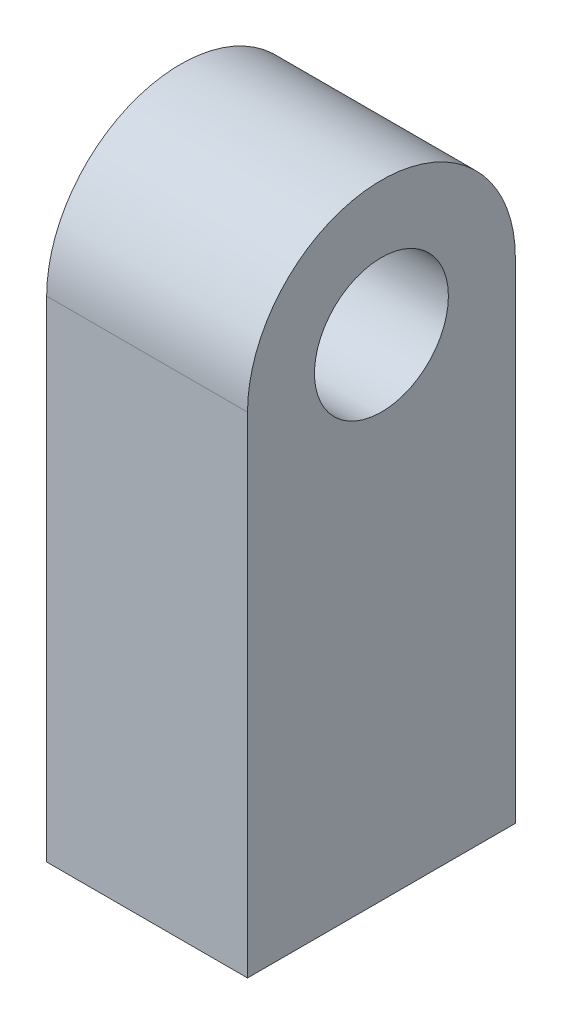
ISO-10303-21;
HEADER;
FILE_DESCRIPTION(('STEP AP214'),'2;1');
FILE_NAME('part.step','',(''),(''),'','','');
FILE_SCHEMA(('AUTOMOTIVE_DESIGN { 1 0 10303 214 1 1 1 1 }'));
ENDSEC;
DATA;
#1=APPLICATION_CONTEXT('core data for automotive mechanical design processes');
#2=APPLICATION_PROTOCOL_DEFINITION('international standard','automotive_design',2000,#1);
#3=PRODUCT_CONTEXT('',#1,'mechanical');
#4=PRODUCT('Part','Part','',(#3));
#5=PRODUCT_RELATED_PRODUCT_CATEGORY('part','',(#4));
#6=PRODUCT_DEFINITION_FORMATION('','',#4);
#7=PRODUCT_DEFINITION_CONTEXT('part definition',#1,'design');
#8=PRODUCT_DEFINITION('design','',#6,#7);
#9=PRODUCT_DEFINITION_SHAPE('','',#8);
#10=(LENGTH_UNIT() NAMED_UNIT(*) SI_UNIT(.MILLI.,.METRE.));
#11=(NAMED_UNIT(*) PLANE_ANGLE_UNIT() SI_UNIT($,.RADIAN.));
#12=(NAMED_UNIT(*) SI_UNIT($,.STERADIAN.) SOLID_ANGLE_UNIT());
#13=UNCERTAINTY_MEASURE_WITH_UNIT(LENGTH_MEASURE(1.E-05),#10,'distance_accuracy_value','');
#14=(GEOMETRIC_REPRESENTATION_CONTEXT(3) GLOBAL_UNCERTAINTY_ASSIGNED_CONTEXT((#13)) GLOBAL_UNIT_ASSIGNED_CONTEXT((#10,
#11,#12)) REPRESENTATION_CONTEXT('',''));
#15=CARTESIAN_POINT('',(0.,0.,0.));
#16=DIRECTION('',(0.,0.,1.));
#17=DIRECTION('',(1.,0.,0.));
#18=AXIS2_PLACEMENT_3D('',#15,#16,#17);
#19=CARTESIAN_POINT('',(4.5,28.,6.));
#20=DIRECTION('',(-1.,0.,0.));
#21=DIRECTION('',(0.,0.,1.));
#22=AXIS2_PLACEMENT_3D('',#19,#20,#21);
#23=PLANE('',#22);
#24=CARTESIAN_POINT('',(4.5,21.9586091682412,0.));
#25=DIRECTION('',(1.,0.,0.));
#26=DIRECTION('',(0.,0.,-1.));
#27=AXIS2_PLACEMENT_3D('',#24,#25,#26);
#28=CIRCLE('',#27,3.);
#29=CARTESIAN_POINT('',(4.5,21.9586091682412,-3.));
#30=VERTEX_POINT('',#29);
#31=EDGE_CURVE('E132',#30,#30,#28,.T.);
#32=ORIENTED_EDGE('',*,*,#31,.F.);
#33=EDGE_LOOP('',(#32));
#34=FACE_BOUND('',#33,.T.);
#35=CARTESIAN_POINT('',(4.5,21.9586091682412,0.));
#36=DIRECTION('',(1.,0.,0.));
#37=DIRECTION('',(0.,0.,-1.));
#38=AXIS2_PLACEMENT_3D('',#35,#36,#37);
#39=CIRCLE('',#38,6.);
#40=CARTESIAN_POINT('',(4.5,21.9586091682412,-6.));
#41=VERTEX_POINT('',#40);
#42=CARTESIAN_POINT('',(4.5,21.9586091682412,6.));
#43=VERTEX_POINT('',#42);
#44=EDGE_CURVE('E80',#41,#43,#39,.T.);
#45=ORIENTED_EDGE('',*,*,#44,.T.);
#46=DIRECTION('',(0.,-1.,0.));
#47=VECTOR('',#46,1.);
#48=CARTESIAN_POINT('',(4.5,28.,6.));
#49=LINE('',#48,#47);
#50=CARTESIAN_POINT('',(4.5,0.,6.));
#51=VERTEX_POINT('',#50);
#52=EDGE_CURVE('E64',#43,#51,#49,.T.);
#53=ORIENTED_EDGE('',*,*,#52,.T.);
#54=DIRECTION('',(0.,0.,-1.));
#55=VECTOR('',#54,1.);
#56=CARTESIAN_POINT('',(4.5,0.,6.));
#57=LINE('',#56,#55);
#58=CARTESIAN_POINT('',(4.5,0.,-6.));
#59=VERTEX_POINT('',#58);
#60=EDGE_CURVE('E95',#51,#59,#57,.T.);
#61=ORIENTED_EDGE('',*,*,#60,.T.);
#62=DIRECTION('',(0.,-1.,0.));
#63=VECTOR('',#62,1.);
#64=CARTESIAN_POINT('',(4.5,28.,-6.));
#65=LINE('',#64,#63);
#66=EDGE_CURVE('E12',#41,#59,#65,.T.);
#67=ORIENTED_EDGE('',*,*,#66,.F.);
#68=EDGE_LOOP('',(#45,#53,#61,#67));
#69=FACE_BOUND('',#68,.T.);
#70=ADVANCED_FACE('F42',(#34,#69),#23,.F.);
#71=CARTESIAN_POINT('',(-4.5,28.,6.));
#72=DIRECTION('',(1.,0.,0.));
#73=DIRECTION('',(0.,0.,-1.));
#74=AXIS2_PLACEMENT_3D('',#71,#72,#73);
#75=PLANE('',#74);
#76=CARTESIAN_POINT('',(-4.5,21.9586091682412,0.));
#77=DIRECTION('',(1.,0.,0.));
#78=DIRECTION('',(0.,0.,-1.));
#79=AXIS2_PLACEMENT_3D('',#76,#77,#78);
#80=CIRCLE('',#79,3.);
#81=CARTESIAN_POINT('',(-4.5,21.9586091682412,-3.));
#82=VERTEX_POINT('',#81);
#83=EDGE_CURVE('E134',#82,#82,#80,.T.);
#84=ORIENTED_EDGE('',*,*,#83,.T.);
#85=EDGE_LOOP('',(#84));
#86=FACE_BOUND('',#85,.T.);
#87=CARTESIAN_POINT('',(-4.5,21.9586091682412,0.));
#88=DIRECTION('',(1.,0.,0.));
#89=DIRECTION('',(0.,0.,-1.));
#90=AXIS2_PLACEMENT_3D('',#87,#88,#89);
#91=CIRCLE('',#90,6.);
#92=CARTESIAN_POINT('',(-4.5,21.9586091682412,-6.));
#93=VERTEX_POINT('',#92);
#94=CARTESIAN_POINT('',(-4.5,21.9586091682412,6.));
#95=VERTEX_POINT('',#94);
#96=EDGE_CURVE('E56',#93,#95,#91,.T.);
#97=ORIENTED_EDGE('',*,*,#96,.F.);
#98=DIRECTION('',(0.,-1.,0.));
#99=VECTOR('',#98,1.);
#100=CARTESIAN_POINT('',(-4.5,28.,-6.));
#101=LINE('',#100,#99);
#102=CARTESIAN_POINT('',(-4.5,0.,-6.));
#103=VERTEX_POINT('',#102);
#104=EDGE_CURVE('E49',#93,#103,#101,.T.);
#105=ORIENTED_EDGE('',*,*,#104,.T.);
#106=DIRECTION('',(0.,0.,1.));
#107=VECTOR('',#106,1.);
#108=CARTESIAN_POINT('',(-4.5,0.,6.));
#109=LINE('',#108,#107);
#110=CARTESIAN_POINT('',(-4.5,0.,6.));
#111=VERTEX_POINT('',#110);
#112=EDGE_CURVE('E100',#103,#111,#109,.T.);
#113=ORIENTED_EDGE('',*,*,#112,.T.);
#114=DIRECTION('',(0.,-1.,0.));
#115=VECTOR('',#114,1.);
#116=CARTESIAN_POINT('',(-4.5,28.,6.));
#117=LINE('',#116,#115);
#118=EDGE_CURVE('E109',#95,#111,#117,.T.);
#119=ORIENTED_EDGE('',*,*,#118,.F.);
#120=EDGE_LOOP('',(#97,#105,#113,#119));
#121=FACE_BOUND('',#120,.T.);
#122=ADVANCED_FACE('F111',(#86,#121),#75,.F.);
#123=CARTESIAN_POINT('',(-4.5,28.,6.));
#124=DIRECTION('',(0.,0.,-1.));
#125=DIRECTION('',(-1.,0.,0.));
#126=AXIS2_PLACEMENT_3D('',#123,#124,#125);
#127=PLANE('',#126);
#128=DIRECTION('',(1.,0.,0.));
#129=VECTOR('',#128,1.);
#130=CARTESIAN_POINT('',(-4.5,21.9586091682412,6.));
#131=LINE('',#130,#129);
#132=EDGE_CURVE('E84',#95,#43,#131,.T.);
#133=ORIENTED_EDGE('',*,*,#132,.F.);
#134=ORIENTED_EDGE('',*,*,#118,.T.);
#135=DIRECTION('',(1.,0.,0.));
#136=VECTOR('',#135,1.);
#137=CARTESIAN_POINT('',(-4.5,0.,6.));
#138=LINE('',#137,#136);
#139=EDGE_CURVE('E106',#111,#51,#138,.T.);
#140=ORIENTED_EDGE('',*,*,#139,.T.);
#141=ORIENTED_EDGE('',*,*,#52,.F.);
#142=EDGE_LOOP('',(#133,#134,#140,#141));
#143=FACE_BOUND('',#142,.T.);
#144=ADVANCED_FACE('F116',(#143),#127,.F.);
#145=CARTESIAN_POINT('',(-4.5,28.,-6.));
#146=DIRECTION('',(0.,0.,1.));
#147=DIRECTION('',(1.,0.,0.));
#148=AXIS2_PLACEMENT_3D('',#145,#146,#147);
#149=PLANE('',#148);
#150=ORIENTED_EDGE('',*,*,#104,.F.);
#151=DIRECTION('',(1.,0.,0.));
#152=VECTOR('',#151,1.);
#153=CARTESIAN_POINT('',(-4.5,21.9586091682412,-6.));
#154=LINE('',#153,#152);
#155=EDGE_CURVE('E83',#93,#41,#154,.T.);
#156=ORIENTED_EDGE('',*,*,#155,.T.);
#157=ORIENTED_EDGE('',*,*,#66,.T.);
#158=DIRECTION('',(-1.,0.,0.));
#159=VECTOR('',#158,1.);
#160=CARTESIAN_POINT('',(-4.5,0.,-6.));
#161=LINE('',#160,#159);
#162=EDGE_CURVE('E98',#59,#103,#161,.T.);
#163=ORIENTED_EDGE('',*,*,#162,.T.);
#164=EDGE_LOOP('',(#150,#156,#157,#163));
#165=FACE_BOUND('',#164,.T.);
#166=ADVANCED_FACE('F90',(#165),#149,.F.);
#167=CARTESIAN_POINT('',(0.,0.,0.));
#168=DIRECTION('',(0.,-1.,0.));
#169=DIRECTION('',(0.,0.,-1.));
#170=AXIS2_PLACEMENT_3D('',#167,#168,#169);
#171=PLANE('',#170);
#172=CARTESIAN_POINT('',(0.,0.,0.));
#173=DIRECTION('',(0.,-1.,0.));
#174=DIRECTION('',(0.,0.,-1.));
#175=AXIS2_PLACEMENT_3D('',#172,#173,#174);
#176=CIRCLE('',#175,3.);
#177=CARTESIAN_POINT('',(0.,0.,-3.));
#178=VERTEX_POINT('',#177);
#179=EDGE_CURVE('E137',#178,#178,#176,.T.);
#180=ORIENTED_EDGE('',*,*,#179,.F.);
#181=EDGE_LOOP('',(#180));
#182=FACE_BOUND('',#181,.T.);
#183=ORIENTED_EDGE('',*,*,#60,.F.);
#184=ORIENTED_EDGE('',*,*,#139,.F.);
#185=ORIENTED_EDGE('',*,*,#112,.F.);
#186=ORIENTED_EDGE('',*,*,#162,.F.);
#187=EDGE_LOOP('',(#183,#184,#185,#186));
#188=FACE_BOUND('',#187,.T.);
#189=ADVANCED_FACE('F114',(#182,#188),#171,.T.);
#190=CARTESIAN_POINT('',(-4.5,21.9586091682412,0.));
#191=DIRECTION('',(1.,0.,0.));
#192=DIRECTION('',(0.,0.,-1.));
#193=AXIS2_PLACEMENT_3D('',#190,#191,#192);
#194=CYLINDRICAL_SURFACE('',#193,6.);
#195=ORIENTED_EDGE('',*,*,#44,.F.);
#196=ORIENTED_EDGE('',*,*,#155,.F.);
#197=ORIENTED_EDGE('',*,*,#96,.T.);
#198=ORIENTED_EDGE('',*,*,#132,.T.);
#199=EDGE_LOOP('',(#195,#196,#197,#198));
#200=FACE_BOUND('',#199,.T.);
#201=ADVANCED_FACE('F82',(#200),#194,.T.);
#202=CARTESIAN_POINT('',(0.,10.,0.));
#203=DIRECTION('',(0.,-1.,0.));
#204=DIRECTION('',(0.,0.,-1.));
#205=AXIS2_PLACEMENT_3D('',#202,#203,#204);
#206=CYLINDRICAL_SURFACE('',#205,3.);
#207=CARTESIAN_POINT('',(0.,10.,0.));
#208=DIRECTION('',(0.,-1.,0.));
#209=DIRECTION('',(0.,0.,-1.));
#210=AXIS2_PLACEMENT_3D('',#207,#208,#209);
#211=CIRCLE('',#210,3.);
#212=CARTESIAN_POINT('',(0.,10.,-3.));
#213=VERTEX_POINT('',#212);
#214=EDGE_CURVE('E86',#213,#213,#211,.T.);
#215=ORIENTED_EDGE('',*,*,#214,.F.);
#216=EDGE_LOOP('',(#215));
#217=FACE_BOUND('',#216,.T.);
#218=ORIENTED_EDGE('',*,*,#179,.T.);
#219=EDGE_LOOP('',(#218));
#220=FACE_BOUND('',#219,.T.);
#221=ADVANCED_FACE('F146',(#217,#220),#206,.F.);
#222=CARTESIAN_POINT('',(0.,10.,0.));
#223=DIRECTION('',(0.,-1.,0.));
#224=DIRECTION('',(0.,0.,-1.));
#225=AXIS2_PLACEMENT_3D('',#222,#223,#224);
#226=PLANE('',#225);
#227=ORIENTED_EDGE('',*,*,#214,.T.);
#228=EDGE_LOOP('',(#227));
#229=FACE_BOUND('',#228,.T.);
#230=ADVANCED_FACE('F156',(#229),#226,.T.);
#231=CARTESIAN_POINT('',(-4.5,21.9586091682412,0.));
#232=DIRECTION('',(1.,0.,0.));
#233=DIRECTION('',(0.,0.,-1.));
#234=AXIS2_PLACEMENT_3D('',#231,#232,#233);
#235=CYLINDRICAL_SURFACE('',#234,3.);
#236=ORIENTED_EDGE('',*,*,#83,.F.);
#237=EDGE_LOOP('',(#236));
#238=FACE_BOUND('',#237,.T.);
#239=ORIENTED_EDGE('',*,*,#31,.T.);
#240=EDGE_LOOP('',(#239));
#241=FACE_BOUND('',#240,.T.);
#242=ADVANCED_FACE('F160',(#238,#241),#235,.F.);
#243=CLOSED_SHELL('',(#70,#122,#144,#166,#189,#201,#221,#230,#242));
#244=MANIFOLD_SOLID_BREP('B2',#243);
#245=ADVANCED_BREP_SHAPE_REPRESENTATION('',(#18,#244),#14);
#246=SHAPE_DEFINITION_REPRESENTATION(#9,#245);
ENDSEC;
END-ISO-10303-21;
